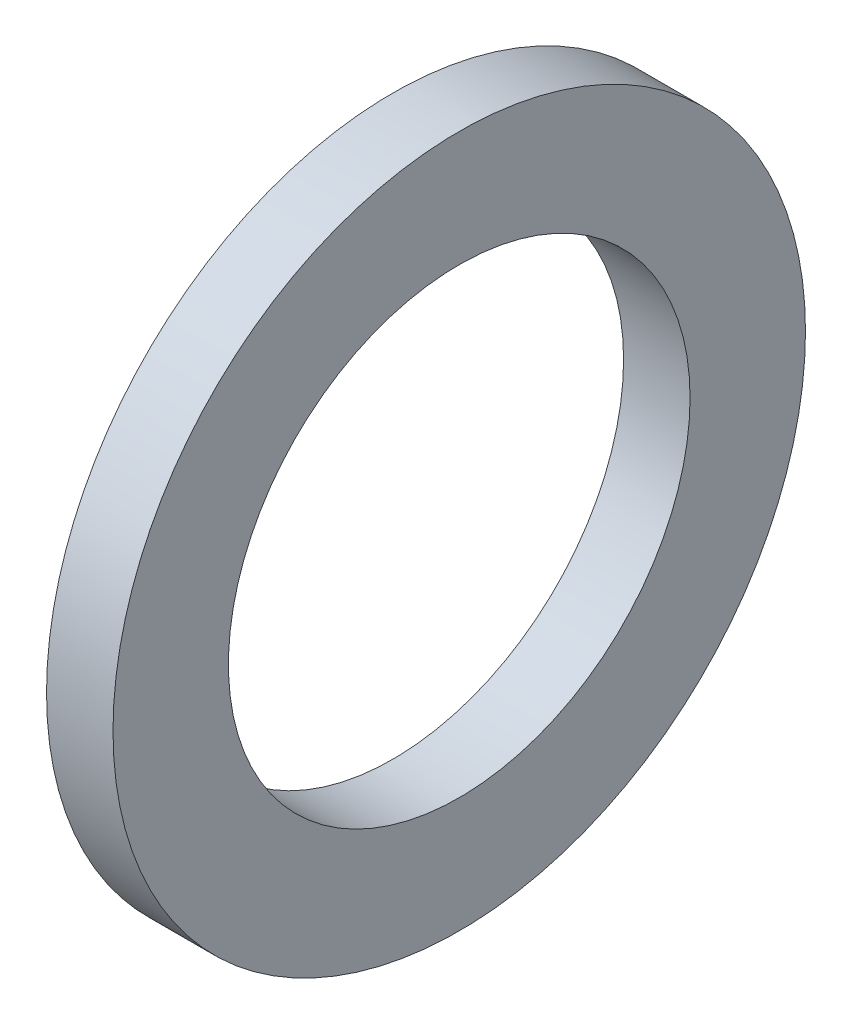
ISO-10303-21;
HEADER;
FILE_DESCRIPTION(('STEP AP214'),'2;1');
FILE_NAME('part.step','',(''),(''),'','','');
FILE_SCHEMA(('AUTOMOTIVE_DESIGN { 1 0 10303 214 1 1 1 1 }'));
ENDSEC;
DATA;
#1=APPLICATION_CONTEXT('core data for automotive mechanical design processes');
#2=APPLICATION_PROTOCOL_DEFINITION('international standard','automotive_design',2000,#1);
#3=PRODUCT_CONTEXT('',#1,'mechanical');
#4=PRODUCT('Part','Part','',(#3));
#5=PRODUCT_RELATED_PRODUCT_CATEGORY('part','',(#4));
#6=PRODUCT_DEFINITION_FORMATION('','',#4);
#7=PRODUCT_DEFINITION_CONTEXT('part definition',#1,'design');
#8=PRODUCT_DEFINITION('design','',#6,#7);
#9=PRODUCT_DEFINITION_SHAPE('','',#8);
#10=(LENGTH_UNIT() NAMED_UNIT(*) SI_UNIT(.MILLI.,.METRE.));
#11=(NAMED_UNIT(*) PLANE_ANGLE_UNIT() SI_UNIT($,.RADIAN.));
#12=(NAMED_UNIT(*) SI_UNIT($,.STERADIAN.) SOLID_ANGLE_UNIT());
#13=UNCERTAINTY_MEASURE_WITH_UNIT(LENGTH_MEASURE(1.E-05),#10,'distance_accuracy_value','');
#14=(GEOMETRIC_REPRESENTATION_CONTEXT(3) GLOBAL_UNCERTAINTY_ASSIGNED_CONTEXT((#13)) GLOBAL_UNIT_ASSIGNED_CONTEXT((#10,
#11,#12)) REPRESENTATION_CONTEXT('',''));
#15=CARTESIAN_POINT('',(0.,0.,0.));
#16=DIRECTION('',(0.,0.,1.));
#17=DIRECTION('',(1.,0.,0.));
#18=AXIS2_PLACEMENT_3D('',#15,#16,#17);
#19=CARTESIAN_POINT('',(0.91440000000001,0.,0.));
#20=DIRECTION('',(1.,0.,0.));
#21=DIRECTION('',(0.,0.,-1.00000000000001));
#22=AXIS2_PLACEMENT_3D('',#19,#20,#21);
#23=PLANE('',#22);
#24=CARTESIAN_POINT('',(0.91440000000001,0.,0.));
#25=DIRECTION('',(1.,0.,0.));
#26=DIRECTION('',(0.,0.,-1.00000000000001));
#27=AXIS2_PLACEMENT_3D('',#24,#25,#26);
#28=CIRCLE('',#27,4.7625);
#29=CARTESIAN_POINT('',(0.91440000000001,0.,-4.76250000000006));
#30=VERTEX_POINT('',#29);
#31=EDGE_CURVE('E10',#30,#30,#28,.T.);
#32=ORIENTED_EDGE('',*,*,#31,.T.);
#33=EDGE_LOOP('',(#32));
#34=FACE_BOUND('',#33,.T.);
#35=CARTESIAN_POINT('',(0.91440000000001,0.,0.));
#36=DIRECTION('',(1.,0.,0.));
#37=DIRECTION('',(0.,0.,-1.00000000000001));
#38=AXIS2_PLACEMENT_3D('',#35,#36,#37);
#39=CIRCLE('',#38,3.175);
#40=CARTESIAN_POINT('',(0.91440000000001,0.,-3.17500000000004));
#41=VERTEX_POINT('',#40);
#42=EDGE_CURVE('E44',#41,#41,#39,.T.);
#43=ORIENTED_EDGE('',*,*,#42,.F.);
#44=EDGE_LOOP('',(#43));
#45=FACE_BOUND('',#44,.T.);
#46=ADVANCED_FACE('F33',(#34,#45),#23,.T.);
#47=CARTESIAN_POINT('',(0.,0.,0.));
#48=DIRECTION('',(1.,0.,0.));
#49=DIRECTION('',(0.,0.,-1.00000000000001));
#50=AXIS2_PLACEMENT_3D('',#47,#48,#49);
#51=PLANE('',#50);
#52=CARTESIAN_POINT('',(0.,0.,0.));
#53=DIRECTION('',(1.,0.,0.));
#54=DIRECTION('',(0.,0.,-1.00000000000001));
#55=AXIS2_PLACEMENT_3D('',#52,#53,#54);
#56=CIRCLE('',#55,4.7625);
#57=CARTESIAN_POINT('',(0.,0.,-4.76250000000006));
#58=VERTEX_POINT('',#57);
#59=EDGE_CURVE('E37',#58,#58,#56,.T.);
#60=ORIENTED_EDGE('',*,*,#59,.F.);
#61=EDGE_LOOP('',(#60));
#62=FACE_BOUND('',#61,.T.);
#63=CARTESIAN_POINT('',(0.,0.,0.));
#64=DIRECTION('',(1.,0.,0.));
#65=DIRECTION('',(0.,0.,-1.00000000000001));
#66=AXIS2_PLACEMENT_3D('',#63,#64,#65);
#67=CIRCLE('',#66,3.175);
#68=CARTESIAN_POINT('',(0.,0.,-3.17500000000004));
#69=VERTEX_POINT('',#68);
#70=EDGE_CURVE('E46',#69,#69,#67,.T.);
#71=ORIENTED_EDGE('',*,*,#70,.T.);
#72=EDGE_LOOP('',(#71));
#73=FACE_BOUND('',#72,.T.);
#74=ADVANCED_FACE('F56',(#62,#73),#51,.F.);
#75=CARTESIAN_POINT('',(0.91440000000001,0.,0.));
#76=DIRECTION('',(-1.,0.,0.));
#77=DIRECTION('',(0.,0.,1.00000000000001));
#78=AXIS2_PLACEMENT_3D('',#75,#76,#77);
#79=CYLINDRICAL_SURFACE('',#78,4.7625);
#80=ORIENTED_EDGE('',*,*,#31,.F.);
#81=EDGE_LOOP('',(#80));
#82=FACE_BOUND('',#81,.T.);
#83=ORIENTED_EDGE('',*,*,#59,.T.);
#84=EDGE_LOOP('',(#83));
#85=FACE_BOUND('',#84,.T.);
#86=ADVANCED_FACE('F35',(#82,#85),#79,.T.);
#87=CARTESIAN_POINT('',(0.91440000000001,0.,0.));
#88=DIRECTION('',(-1.,0.,0.));
#89=DIRECTION('',(0.,0.,1.00000000000001));
#90=AXIS2_PLACEMENT_3D('',#87,#88,#89);
#91=CYLINDRICAL_SURFACE('',#90,3.175);
#92=ORIENTED_EDGE('',*,*,#42,.T.);
#93=EDGE_LOOP('',(#92));
#94=FACE_BOUND('',#93,.T.);
#95=ORIENTED_EDGE('',*,*,#70,.F.);
#96=EDGE_LOOP('',(#95));
#97=FACE_BOUND('',#96,.T.);
#98=ADVANCED_FACE('F52',(#94,#97),#91,.F.);
#99=CLOSED_SHELL('',(#46,#74,#86,#98));
#100=MANIFOLD_SOLID_BREP('B2',#99);
#101=ADVANCED_BREP_SHAPE_REPRESENTATION('',(#18,#100),#14);
#102=SHAPE_DEFINITION_REPRESENTATION(#9,#101);
ENDSEC;
END-ISO-10303-21;
